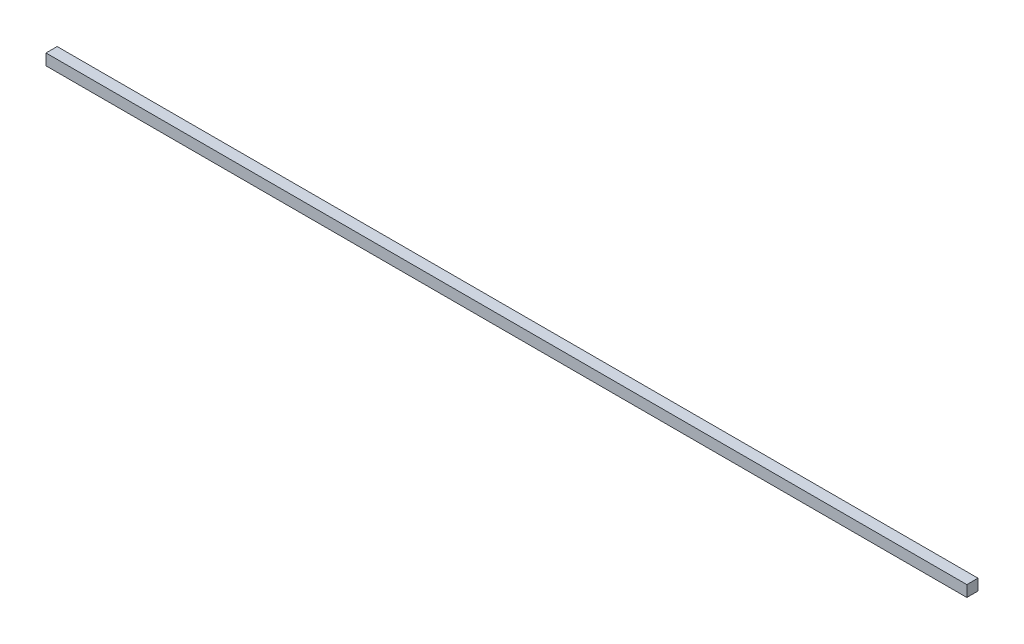
ISO-10303-21;
HEADER;
FILE_DESCRIPTION(('STEP AP214'),'2;1');
FILE_NAME('part.step','',(''),(''),'','','');
FILE_SCHEMA(('AUTOMOTIVE_DESIGN { 1 0 10303 214 1 1 1 1 }'));
ENDSEC;
DATA;
#1=APPLICATION_CONTEXT('core data for automotive mechanical design processes');
#2=APPLICATION_PROTOCOL_DEFINITION('international standard','automotive_design',2000,#1);
#3=PRODUCT_CONTEXT('',#1,'mechanical');
#4=PRODUCT('Part','Part','',(#3));
#5=PRODUCT_RELATED_PRODUCT_CATEGORY('part','',(#4));
#6=PRODUCT_DEFINITION_FORMATION('','',#4);
#7=PRODUCT_DEFINITION_CONTEXT('part definition',#1,'design');
#8=PRODUCT_DEFINITION('design','',#6,#7);
#9=PRODUCT_DEFINITION_SHAPE('','',#8);
#10=(LENGTH_UNIT() NAMED_UNIT(*) SI_UNIT(.MILLI.,.METRE.));
#11=(NAMED_UNIT(*) PLANE_ANGLE_UNIT() SI_UNIT($,.RADIAN.));
#12=(NAMED_UNIT(*) SI_UNIT($,.STERADIAN.) SOLID_ANGLE_UNIT());
#13=UNCERTAINTY_MEASURE_WITH_UNIT(LENGTH_MEASURE(1.E-05),#10,'distance_accuracy_value','');
#14=(GEOMETRIC_REPRESENTATION_CONTEXT(3) GLOBAL_UNCERTAINTY_ASSIGNED_CONTEXT((#13)) GLOBAL_UNIT_ASSIGNED_CONTEXT((#10,
#11,#12)) REPRESENTATION_CONTEXT('',''));
#15=CARTESIAN_POINT('',(0.,0.,0.));
#16=DIRECTION('',(0.,0.,1.));
#17=DIRECTION('',(1.,0.,0.));
#18=AXIS2_PLACEMENT_3D('',#15,#16,#17);
#19=CARTESIAN_POINT('',(20.,742.,30.));
#20=DIRECTION('',(1.,0.,0.));
#21=DIRECTION('',(0.,0.,-1.));
#22=AXIS2_PLACEMENT_3D('',#19,#20,#21);
#23=PLANE('',#22);
#24=DIRECTION('',(0.,-1.,0.));
#25=VECTOR('',#24,1.);
#26=CARTESIAN_POINT('',(20.,742.,22.));
#27=LINE('',#26,#25);
#28=CARTESIAN_POINT('',(20.,750.,22.));
#29=VERTEX_POINT('',#28);
#30=CARTESIAN_POINT('',(20.,742.,22.));
#31=VERTEX_POINT('',#30);
#32=EDGE_CURVE('E102',#29,#31,#27,.T.);
#33=ORIENTED_EDGE('',*,*,#32,.T.);
#34=DIRECTION('',(0.,0.,-1.));
#35=VECTOR('',#34,1.);
#36=CARTESIAN_POINT('',(20.,742.,30.));
#37=LINE('',#36,#35);
#38=CARTESIAN_POINT('',(20.,742.,30.));
#39=VERTEX_POINT('',#38);
#40=EDGE_CURVE('E11',#39,#31,#37,.T.);
#41=ORIENTED_EDGE('',*,*,#40,.F.);
#42=DIRECTION('',(0.,-1.,0.));
#43=VECTOR('',#42,1.);
#44=CARTESIAN_POINT('',(20.,742.,30.));
#45=LINE('',#44,#43);
#46=CARTESIAN_POINT('',(20.,750.,30.));
#47=VERTEX_POINT('',#46);
#48=EDGE_CURVE('E90',#47,#39,#45,.T.);
#49=ORIENTED_EDGE('',*,*,#48,.F.);
#50=DIRECTION('',(0.,0.,-1.));
#51=VECTOR('',#50,1.);
#52=CARTESIAN_POINT('',(20.,750.,30.));
#53=LINE('',#52,#51);
#54=EDGE_CURVE('E98',#47,#29,#53,.T.);
#55=ORIENTED_EDGE('',*,*,#54,.T.);
#56=EDGE_LOOP('',(#33,#41,#49,#55));
#57=FACE_BOUND('',#56,.T.);
#58=ADVANCED_FACE('F39',(#57),#23,.F.);
#59=CARTESIAN_POINT('',(20.,742.,30.));
#60=DIRECTION('',(0.,1.,0.));
#61=DIRECTION('',(0.,0.,1.));
#62=AXIS2_PLACEMENT_3D('',#59,#60,#61);
#63=PLANE('',#62);
#64=DIRECTION('',(1.,0.,0.));
#65=VECTOR('',#64,1.);
#66=CARTESIAN_POINT('',(20.,742.,22.));
#67=LINE('',#66,#65);
#68=CARTESIAN_POINT('',(680.,742.,22.));
#69=VERTEX_POINT('',#68);
#70=EDGE_CURVE('E94',#31,#69,#67,.T.);
#71=ORIENTED_EDGE('',*,*,#70,.T.);
#72=DIRECTION('',(0.,0.,-1.));
#73=VECTOR('',#72,1.);
#74=CARTESIAN_POINT('',(680.,742.,30.));
#75=LINE('',#74,#73);
#76=CARTESIAN_POINT('',(680.,742.,30.));
#77=VERTEX_POINT('',#76);
#78=EDGE_CURVE('E47',#77,#69,#75,.T.);
#79=ORIENTED_EDGE('',*,*,#78,.F.);
#80=DIRECTION('',(1.,0.,0.));
#81=VECTOR('',#80,1.);
#82=CARTESIAN_POINT('',(20.,742.,30.));
#83=LINE('',#82,#81);
#84=EDGE_CURVE('E85',#39,#77,#83,.T.);
#85=ORIENTED_EDGE('',*,*,#84,.F.);
#86=ORIENTED_EDGE('',*,*,#40,.T.);
#87=EDGE_LOOP('',(#71,#79,#85,#86));
#88=FACE_BOUND('',#87,.T.);
#89=ADVANCED_FACE('F93',(#88),#63,.F.);
#90=CARTESIAN_POINT('',(680.,742.,30.));
#91=DIRECTION('',(-1.,0.,0.));
#92=DIRECTION('',(0.,0.,1.));
#93=AXIS2_PLACEMENT_3D('',#90,#91,#92);
#94=PLANE('',#93);
#95=DIRECTION('',(0.,1.,0.));
#96=VECTOR('',#95,1.);
#97=CARTESIAN_POINT('',(680.,742.,22.));
#98=LINE('',#97,#96);
#99=CARTESIAN_POINT('',(680.,750.,22.));
#100=VERTEX_POINT('',#99);
#101=EDGE_CURVE('E72',#69,#100,#98,.T.);
#102=ORIENTED_EDGE('',*,*,#101,.T.);
#103=DIRECTION('',(0.,0.,-1.));
#104=VECTOR('',#103,1.);
#105=CARTESIAN_POINT('',(680.,750.,30.));
#106=LINE('',#105,#104);
#107=CARTESIAN_POINT('',(680.,750.,30.));
#108=VERTEX_POINT('',#107);
#109=EDGE_CURVE('E95',#108,#100,#106,.T.);
#110=ORIENTED_EDGE('',*,*,#109,.F.);
#111=DIRECTION('',(0.,1.,0.));
#112=VECTOR('',#111,1.);
#113=CARTESIAN_POINT('',(680.,742.,30.));
#114=LINE('',#113,#112);
#115=EDGE_CURVE('E88',#77,#108,#114,.T.);
#116=ORIENTED_EDGE('',*,*,#115,.F.);
#117=ORIENTED_EDGE('',*,*,#78,.T.);
#118=EDGE_LOOP('',(#102,#110,#116,#117));
#119=FACE_BOUND('',#118,.T.);
#120=ADVANCED_FACE('F96',(#119),#94,.F.);
#121=CARTESIAN_POINT('',(20.,750.,30.));
#122=DIRECTION('',(0.,-1.,0.));
#123=DIRECTION('',(0.,0.,-1.));
#124=AXIS2_PLACEMENT_3D('',#121,#122,#123);
#125=PLANE('',#124);
#126=DIRECTION('',(-1.,0.,0.));
#127=VECTOR('',#126,1.);
#128=CARTESIAN_POINT('',(20.,750.,22.));
#129=LINE('',#128,#127);
#130=EDGE_CURVE('E78',#100,#29,#129,.T.);
#131=ORIENTED_EDGE('',*,*,#130,.T.);
#132=ORIENTED_EDGE('',*,*,#54,.F.);
#133=DIRECTION('',(-1.,0.,0.));
#134=VECTOR('',#133,1.);
#135=CARTESIAN_POINT('',(20.,750.,30.));
#136=LINE('',#135,#134);
#137=EDGE_CURVE('E55',#108,#47,#136,.T.);
#138=ORIENTED_EDGE('',*,*,#137,.F.);
#139=ORIENTED_EDGE('',*,*,#109,.T.);
#140=EDGE_LOOP('',(#131,#132,#138,#139));
#141=FACE_BOUND('',#140,.T.);
#142=ADVANCED_FACE('F109',(#141),#125,.F.);
#143=CARTESIAN_POINT('',(0.,0.,30.));
#144=DIRECTION('',(0.,0.,-1.));
#145=DIRECTION('',(-1.,0.,0.));
#146=AXIS2_PLACEMENT_3D('',#143,#144,#145);
#147=PLANE('',#146);
#148=ORIENTED_EDGE('',*,*,#48,.T.);
#149=ORIENTED_EDGE('',*,*,#84,.T.);
#150=ORIENTED_EDGE('',*,*,#115,.T.);
#151=ORIENTED_EDGE('',*,*,#137,.T.);
#152=EDGE_LOOP('',(#148,#149,#150,#151));
#153=FACE_BOUND('',#152,.T.);
#154=ADVANCED_FACE('F86',(#153),#147,.F.);
#155=CARTESIAN_POINT('',(0.,0.,22.));
#156=DIRECTION('',(0.,0.,-1.));
#157=DIRECTION('',(-1.,0.,0.));
#158=AXIS2_PLACEMENT_3D('',#155,#156,#157);
#159=PLANE('',#158);
#160=ORIENTED_EDGE('',*,*,#32,.F.);
#161=ORIENTED_EDGE('',*,*,#130,.F.);
#162=ORIENTED_EDGE('',*,*,#101,.F.);
#163=ORIENTED_EDGE('',*,*,#70,.F.);
#164=EDGE_LOOP('',(#160,#161,#162,#163));
#165=FACE_BOUND('',#164,.T.);
#166=ADVANCED_FACE('F112',(#165),#159,.T.);
#167=CLOSED_SHELL('',(#58,#89,#120,#142,#154,#166));
#168=MANIFOLD_SOLID_BREP('B2',#167);
#169=ADVANCED_BREP_SHAPE_REPRESENTATION('',(#18,#168),#14);
#170=SHAPE_DEFINITION_REPRESENTATION(#9,#169);
ENDSEC;
END-ISO-10303-21;
